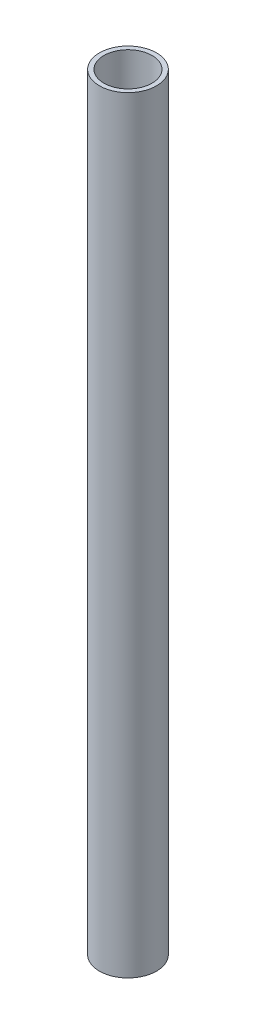
ISO-10303-21;
HEADER;
FILE_DESCRIPTION(('STEP AP214'),'2;1');
FILE_NAME('part.step','',(''),(''),'','','');
FILE_SCHEMA(('AUTOMOTIVE_DESIGN { 1 0 10303 214 1 1 1 1 }'));
ENDSEC;
DATA;
#1=APPLICATION_CONTEXT('core data for automotive mechanical design processes');
#2=APPLICATION_PROTOCOL_DEFINITION('international standard','automotive_design',2000,#1);
#3=PRODUCT_CONTEXT('',#1,'mechanical');
#4=PRODUCT('Part','Part','',(#3));
#5=PRODUCT_RELATED_PRODUCT_CATEGORY('part','',(#4));
#6=PRODUCT_DEFINITION_FORMATION('','',#4);
#7=PRODUCT_DEFINITION_CONTEXT('part definition',#1,'design');
#8=PRODUCT_DEFINITION('design','',#6,#7);
#9=PRODUCT_DEFINITION_SHAPE('','',#8);
#10=(LENGTH_UNIT() NAMED_UNIT(*) SI_UNIT(.MILLI.,.METRE.));
#11=(NAMED_UNIT(*) PLANE_ANGLE_UNIT() SI_UNIT($,.RADIAN.));
#12=(NAMED_UNIT(*) SI_UNIT($,.STERADIAN.) SOLID_ANGLE_UNIT());
#13=UNCERTAINTY_MEASURE_WITH_UNIT(LENGTH_MEASURE(1.E-05),#10,'distance_accuracy_value','');
#14=(GEOMETRIC_REPRESENTATION_CONTEXT(3) GLOBAL_UNCERTAINTY_ASSIGNED_CONTEXT((#13)) GLOBAL_UNIT_ASSIGNED_CONTEXT((#10,
#11,#12)) REPRESENTATION_CONTEXT('',''));
#15=CARTESIAN_POINT('',(0.,0.,0.));
#16=DIRECTION('',(0.,0.,1.));
#17=DIRECTION('',(1.,0.,0.));
#18=AXIS2_PLACEMENT_3D('',#15,#16,#17);
#19=CARTESIAN_POINT('',(0.,255.,0.));
#20=DIRECTION('',(0.,1.,0.));
#21=DIRECTION('',(0.,0.,1.));
#22=AXIS2_PLACEMENT_3D('',#19,#20,#21);
#23=PLANE('',#22);
#24=CARTESIAN_POINT('',(0.,255.,0.));
#25=DIRECTION('',(0.,1.,0.));
#26=DIRECTION('',(0.,0.,1.));
#27=AXIS2_PLACEMENT_3D('',#24,#25,#26);
#28=CIRCLE('',#27,19.);
#29=CARTESIAN_POINT('',(0.,255.,19.));
#30=VERTEX_POINT('',#29);
#31=EDGE_CURVE('E11',#30,#30,#28,.T.);
#32=ORIENTED_EDGE('',*,*,#31,.T.);
#33=EDGE_LOOP('',(#32));
#34=FACE_BOUND('',#33,.T.);
#35=CARTESIAN_POINT('',(0.,255.,0.));
#36=DIRECTION('',(0.,1.,0.));
#37=DIRECTION('',(1.,0.,0.));
#38=AXIS2_PLACEMENT_3D('',#35,#36,#37);
#39=CIRCLE('',#38,16.);
#40=CARTESIAN_POINT('',(16.,255.,0.));
#41=VERTEX_POINT('',#40);
#42=EDGE_CURVE('E68',#41,#41,#39,.T.);
#43=ORIENTED_EDGE('',*,*,#42,.F.);
#44=EDGE_LOOP('',(#43));
#45=FACE_BOUND('',#44,.T.);
#46=ADVANCED_FACE('F57',(#34,#45),#23,.T.);
#47=CARTESIAN_POINT('',(0.,-255.,0.));
#48=DIRECTION('',(0.,1.,0.));
#49=DIRECTION('',(0.,0.,1.));
#50=AXIS2_PLACEMENT_3D('',#47,#48,#49);
#51=PLANE('',#50);
#52=CARTESIAN_POINT('',(0.,-255.,0.));
#53=DIRECTION('',(0.,1.,0.));
#54=DIRECTION('',(0.,0.,1.));
#55=AXIS2_PLACEMENT_3D('',#52,#53,#54);
#56=CIRCLE('',#55,19.);
#57=CARTESIAN_POINT('',(0.,-255.,19.));
#58=VERTEX_POINT('',#57);
#59=EDGE_CURVE('E61',#58,#58,#56,.T.);
#60=ORIENTED_EDGE('',*,*,#59,.F.);
#61=EDGE_LOOP('',(#60));
#62=FACE_BOUND('',#61,.T.);
#63=CARTESIAN_POINT('',(0.,-255.,0.));
#64=DIRECTION('',(0.,1.,0.));
#65=DIRECTION('',(1.,0.,0.));
#66=AXIS2_PLACEMENT_3D('',#63,#64,#65);
#67=CIRCLE('',#66,16.);
#68=CARTESIAN_POINT('',(16.,-255.,0.));
#69=VERTEX_POINT('',#68);
#70=EDGE_CURVE('E70',#69,#69,#67,.T.);
#71=ORIENTED_EDGE('',*,*,#70,.T.);
#72=EDGE_LOOP('',(#71));
#73=FACE_BOUND('',#72,.T.);
#74=ADVANCED_FACE('F80',(#62,#73),#51,.F.);
#75=CARTESIAN_POINT('',(0.,255.,0.));
#76=DIRECTION('',(0.,-1.,0.));
#77=DIRECTION('',(0.,0.,-1.));
#78=AXIS2_PLACEMENT_3D('',#75,#76,#77);
#79=CYLINDRICAL_SURFACE('',#78,19.);
#80=ORIENTED_EDGE('',*,*,#31,.F.);
#81=EDGE_LOOP('',(#80));
#82=FACE_BOUND('',#81,.T.);
#83=ORIENTED_EDGE('',*,*,#59,.T.);
#84=EDGE_LOOP('',(#83));
#85=FACE_BOUND('',#84,.T.);
#86=ADVANCED_FACE('F59',(#82,#85),#79,.T.);
#87=CARTESIAN_POINT('',(0.,255.,0.));
#88=DIRECTION('',(0.,-1.,0.));
#89=DIRECTION('',(0.,0.,-1.));
#90=AXIS2_PLACEMENT_3D('',#87,#88,#89);
#91=CYLINDRICAL_SURFACE('',#90,16.);
#92=ORIENTED_EDGE('',*,*,#42,.T.);
#93=EDGE_LOOP('',(#92));
#94=FACE_BOUND('',#93,.T.);
#95=ORIENTED_EDGE('',*,*,#70,.F.);
#96=EDGE_LOOP('',(#95));
#97=FACE_BOUND('',#96,.T.);
#98=ADVANCED_FACE('F76',(#94,#97),#91,.F.);
#99=CLOSED_SHELL('',(#46,#74,#86,#98));
#100=MANIFOLD_SOLID_BREP('B2',#99);
#101=ADVANCED_BREP_SHAPE_REPRESENTATION('',(#18,#100),#14);
#102=SHAPE_DEFINITION_REPRESENTATION(#9,#101);
ENDSEC;
END-ISO-10303-21;
